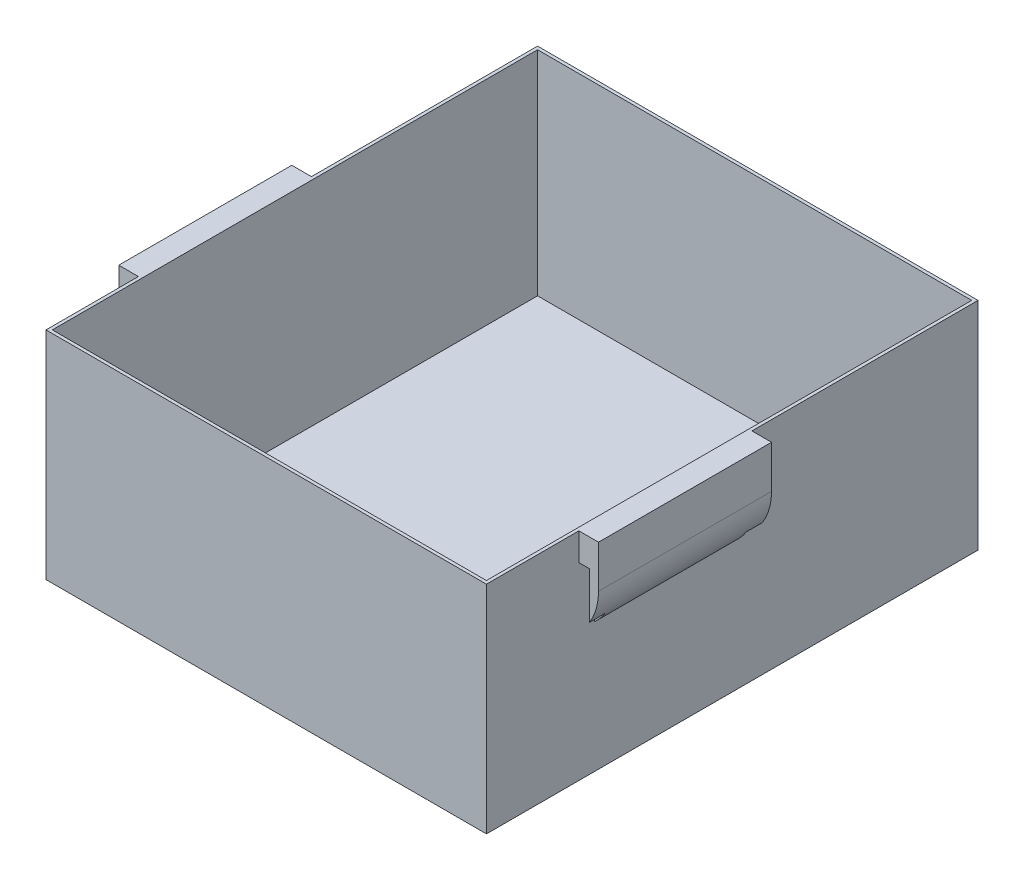
ISO-10303-21;
HEADER;
FILE_DESCRIPTION(('STEP AP214'),'2;1');
FILE_NAME('part.step','',(''),(''),'','','');
FILE_SCHEMA(('AUTOMOTIVE_DESIGN { 1 0 10303 214 1 1 1 1 }'));
ENDSEC;
DATA;
#1=APPLICATION_CONTEXT('core data for automotive mechanical design processes');
#2=APPLICATION_PROTOCOL_DEFINITION('international standard','automotive_design',2000,#1);
#3=PRODUCT_CONTEXT('',#1,'mechanical');
#4=PRODUCT('Part','Part','',(#3));
#5=PRODUCT_RELATED_PRODUCT_CATEGORY('part','',(#4));
#6=PRODUCT_DEFINITION_FORMATION('','',#4);
#7=PRODUCT_DEFINITION_CONTEXT('part definition',#1,'design');
#8=PRODUCT_DEFINITION('design','',#6,#7);
#9=PRODUCT_DEFINITION_SHAPE('','',#8);
#10=(LENGTH_UNIT() NAMED_UNIT(*) SI_UNIT(.MILLI.,.METRE.));
#11=(NAMED_UNIT(*) PLANE_ANGLE_UNIT() SI_UNIT($,.RADIAN.));
#12=(NAMED_UNIT(*) SI_UNIT($,.STERADIAN.) SOLID_ANGLE_UNIT());
#13=UNCERTAINTY_MEASURE_WITH_UNIT(LENGTH_MEASURE(1.E-05),#10,'distance_accuracy_value','');
#14=(GEOMETRIC_REPRESENTATION_CONTEXT(3) GLOBAL_UNCERTAINTY_ASSIGNED_CONTEXT((#13)) GLOBAL_UNIT_ASSIGNED_CONTEXT((#10,
#11,#12)) REPRESENTATION_CONTEXT('',''));
#15=CARTESIAN_POINT('',(0.,0.,0.));
#16=DIRECTION('',(0.,0.,1.));
#17=DIRECTION('',(1.,0.,0.));
#18=AXIS2_PLACEMENT_3D('',#15,#16,#17);
#19=CARTESIAN_POINT('',(-61.,55.,-5.));
#20=DIRECTION('',(0.,0.,-1.));
#21=DIRECTION('',(-1.,0.,0.));
#22=AXIS2_PLACEMENT_3D('',#19,#20,#21);
#23=PLANE('',#22);
#24=DIRECTION('',(0.,-1.,0.));
#25=VECTOR('',#24,1.);
#26=CARTESIAN_POINT('',(-58.65,33.,-5.));
#27=LINE('',#26,#25);
#28=CARTESIAN_POINT('',(-58.65,48.,-5.));
#29=VERTEX_POINT('',#28);
#30=CARTESIAN_POINT('',(-58.65,36.1194776507404,-5.));
#31=VERTEX_POINT('',#30);
#32=EDGE_CURVE('E824',#29,#31,#27,.T.);
#33=ORIENTED_EDGE('',*,*,#32,.T.);
#34=CARTESIAN_POINT('',(-46.,44.1803398874989,-5.));
#35=DIRECTION('',(0.,0.,-1.));
#36=DIRECTION('',(-1.,0.,0.));
#37=AXIS2_PLACEMENT_3D('',#34,#35,#36);
#38=CIRCLE('',#37,15.);
#39=CARTESIAN_POINT('',(-61.,44.1803398874989,-5.));
#40=VERTEX_POINT('',#39);
#41=EDGE_CURVE('E765',#31,#40,#38,.T.);
#42=ORIENTED_EDGE('',*,*,#41,.T.);
#43=DIRECTION('',(0.,1.,0.));
#44=VECTOR('',#43,1.);
#45=CARTESIAN_POINT('',(-61.,55.,-5.));
#46=LINE('',#45,#44);
#47=CARTESIAN_POINT('',(-61.,55.,-5.));
#48=VERTEX_POINT('',#47);
#49=EDGE_CURVE('E773',#40,#48,#46,.T.);
#50=ORIENTED_EDGE('',*,*,#49,.T.);
#51=DIRECTION('',(1.,0.,0.));
#52=VECTOR('',#51,1.);
#53=CARTESIAN_POINT('',(-61.,55.,-5.));
#54=LINE('',#53,#52);
#55=CARTESIAN_POINT('',(-56.,55.,-5.));
#56=VERTEX_POINT('',#55);
#57=EDGE_CURVE('E793',#48,#56,#54,.T.);
#58=ORIENTED_EDGE('',*,*,#57,.T.);
#59=DIRECTION('',(0.,1.,0.));
#60=VECTOR('',#59,1.);
#61=CARTESIAN_POINT('',(-56.,55.,-5.));
#62=LINE('',#61,#60);
#63=CARTESIAN_POINT('',(-56.,48.,-5.));
#64=VERTEX_POINT('',#63);
#65=EDGE_CURVE('E246',#64,#56,#62,.T.);
#66=ORIENTED_EDGE('',*,*,#65,.F.);
#67=DIRECTION('',(-1.,0.,0.));
#68=VECTOR('',#67,1.);
#69=CARTESIAN_POINT('',(-56.,48.,-5.));
#70=LINE('',#69,#68);
#71=EDGE_CURVE('E237',#64,#29,#70,.T.);
#72=ORIENTED_EDGE('',*,*,#71,.T.);
#73=EDGE_LOOP('',(#33,#42,#50,#58,#66,#72));
#74=FACE_BOUND('',#73,.T.);
#75=ADVANCED_FACE('F33',(#74),#23,.T.);
#76=CARTESIAN_POINT('',(-61.,55.,39.));
#77=DIRECTION('',(0.,0.,1.));
#78=DIRECTION('',(1.,0.,0.));
#79=AXIS2_PLACEMENT_3D('',#76,#77,#78);
#80=PLANE('',#79);
#81=DIRECTION('',(0.,-1.,0.));
#82=VECTOR('',#81,1.);
#83=CARTESIAN_POINT('',(-61.,55.,39.));
#84=LINE('',#83,#82);
#85=CARTESIAN_POINT('',(-61.,55.,39.));
#86=VERTEX_POINT('',#85);
#87=CARTESIAN_POINT('',(-61.,44.1803398874989,39.));
#88=VERTEX_POINT('',#87);
#89=EDGE_CURVE('E245',#86,#88,#84,.T.);
#90=ORIENTED_EDGE('',*,*,#89,.T.);
#91=CARTESIAN_POINT('',(-46.,44.1803398874989,39.));
#92=DIRECTION('',(0.,0.,1.));
#93=DIRECTION('',(1.,0.,0.));
#94=AXIS2_PLACEMENT_3D('',#91,#92,#93);
#95=CIRCLE('',#94,15.);
#96=CARTESIAN_POINT('',(-58.65,36.1194776507404,39.));
#97=VERTEX_POINT('',#96);
#98=EDGE_CURVE('E55',#88,#97,#95,.T.);
#99=ORIENTED_EDGE('',*,*,#98,.T.);
#100=DIRECTION('',(0.,1.,0.));
#101=VECTOR('',#100,1.);
#102=CARTESIAN_POINT('',(-58.65,33.,39.));
#103=LINE('',#102,#101);
#104=CARTESIAN_POINT('',(-58.65,48.,39.));
#105=VERTEX_POINT('',#104);
#106=EDGE_CURVE('E789',#97,#105,#103,.T.);
#107=ORIENTED_EDGE('',*,*,#106,.T.);
#108=DIRECTION('',(1.,0.,0.));
#109=VECTOR('',#108,1.);
#110=CARTESIAN_POINT('',(-56.,48.,39.));
#111=LINE('',#110,#109);
#112=CARTESIAN_POINT('',(-56.,48.,39.));
#113=VERTEX_POINT('',#112);
#114=EDGE_CURVE('E786',#105,#113,#111,.T.);
#115=ORIENTED_EDGE('',*,*,#114,.T.);
#116=DIRECTION('',(0.,-1.,0.));
#117=VECTOR('',#116,1.);
#118=CARTESIAN_POINT('',(-56.,55.,39.));
#119=LINE('',#118,#117);
#120=CARTESIAN_POINT('',(-56.,55.,39.));
#121=VERTEX_POINT('',#120);
#122=EDGE_CURVE('E250',#121,#113,#119,.T.);
#123=ORIENTED_EDGE('',*,*,#122,.F.);
#124=DIRECTION('',(1.,0.,0.));
#125=VECTOR('',#124,1.);
#126=CARTESIAN_POINT('',(-61.,55.,39.));
#127=LINE('',#126,#125);
#128=EDGE_CURVE('E270',#86,#121,#127,.T.);
#129=ORIENTED_EDGE('',*,*,#128,.F.);
#130=EDGE_LOOP('',(#90,#99,#107,#115,#123,#129));
#131=FACE_BOUND('',#130,.T.);
#132=ADVANCED_FACE('F464',(#131),#80,.T.);
#133=CARTESIAN_POINT('',(56.,55.,-62.5));
#134=DIRECTION('',(-1.,0.,0.));
#135=DIRECTION('',(0.,0.,1.));
#136=AXIS2_PLACEMENT_3D('',#133,#134,#135);
#137=PLANE('',#136);
#138=DIRECTION('',(0.,-1.,0.));
#139=VECTOR('',#138,1.);
#140=CARTESIAN_POINT('',(56.,55.,39.));
#141=LINE('',#140,#139);
#142=CARTESIAN_POINT('',(56.,55.,39.));
#143=VERTEX_POINT('',#142);
#144=CARTESIAN_POINT('',(56.,48.,39.));
#145=VERTEX_POINT('',#144);
#146=EDGE_CURVE('E291',#143,#145,#141,.T.);
#147=ORIENTED_EDGE('',*,*,#146,.F.);
#148=DIRECTION('',(0.,0.,-1.));
#149=VECTOR('',#148,1.);
#150=CARTESIAN_POINT('',(56.,55.,-62.5));
#151=LINE('',#150,#149);
#152=CARTESIAN_POINT('',(56.,55.,62.5));
#153=VERTEX_POINT('',#152);
#154=EDGE_CURVE('E353',#153,#143,#151,.T.);
#155=ORIENTED_EDGE('',*,*,#154,.F.);
#156=DIRECTION('',(0.,-1.,0.));
#157=VECTOR('',#156,1.);
#158=CARTESIAN_POINT('',(56.,55.,62.5));
#159=LINE('',#158,#157);
#160=CARTESIAN_POINT('',(56.,0.,62.5));
#161=VERTEX_POINT('',#160);
#162=EDGE_CURVE('E329',#153,#161,#159,.T.);
#163=ORIENTED_EDGE('',*,*,#162,.T.);
#164=DIRECTION('',(0.,0.,-1.));
#165=VECTOR('',#164,1.);
#166=CARTESIAN_POINT('',(56.,0.,-62.5));
#167=LINE('',#166,#165);
#168=CARTESIAN_POINT('',(56.,0.,-62.5));
#169=VERTEX_POINT('',#168);
#170=EDGE_CURVE('E330',#161,#169,#167,.T.);
#171=ORIENTED_EDGE('',*,*,#170,.T.);
#172=DIRECTION('',(0.,-1.,0.));
#173=VECTOR('',#172,1.);
#174=CARTESIAN_POINT('',(56.,55.,-62.5));
#175=LINE('',#174,#173);
#176=CARTESIAN_POINT('',(56.,55.,-62.5));
#177=VERTEX_POINT('',#176);
#178=EDGE_CURVE('E349',#177,#169,#175,.T.);
#179=ORIENTED_EDGE('',*,*,#178,.F.);
#180=CARTESIAN_POINT('',(56.,55.,-5.));
#181=VERTEX_POINT('',#180);
#182=EDGE_CURVE('E340',#181,#177,#151,.T.);
#183=ORIENTED_EDGE('',*,*,#182,.F.);
#184=DIRECTION('',(0.,1.,0.));
#185=VECTOR('',#184,1.);
#186=CARTESIAN_POINT('',(56.,55.,-5.));
#187=LINE('',#186,#185);
#188=CARTESIAN_POINT('',(56.,48.,-5.));
#189=VERTEX_POINT('',#188);
#190=EDGE_CURVE('E298',#189,#181,#187,.T.);
#191=ORIENTED_EDGE('',*,*,#190,.F.);
#192=DIRECTION('',(0.,0.,-1.));
#193=VECTOR('',#192,1.);
#194=CARTESIAN_POINT('',(56.,48.,-0.999999999999997));
#195=LINE('',#194,#193);
#196=CARTESIAN_POINT('',(56.,48.,-0.999999999999997));
#197=VERTEX_POINT('',#196);
#198=EDGE_CURVE('E266',#197,#189,#195,.T.);
#199=ORIENTED_EDGE('',*,*,#198,.F.);
#200=DIRECTION('',(0.,1.,0.));
#201=VECTOR('',#200,1.);
#202=CARTESIAN_POINT('',(56.,33.,-0.999999999999997));
#203=LINE('',#202,#201);
#204=CARTESIAN_POINT('',(56.,33.,-0.999999999999997));
#205=VERTEX_POINT('',#204);
#206=EDGE_CURVE('E256',#205,#197,#203,.T.);
#207=ORIENTED_EDGE('',*,*,#206,.F.);
#208=DIRECTION('',(0.,0.,-1.));
#209=VECTOR('',#208,1.);
#210=CARTESIAN_POINT('',(56.,33.,39.));
#211=LINE('',#210,#209);
#212=CARTESIAN_POINT('',(56.,33.,35.));
#213=VERTEX_POINT('',#212);
#214=EDGE_CURVE('E303',#213,#205,#211,.T.);
#215=ORIENTED_EDGE('',*,*,#214,.F.);
#216=DIRECTION('',(0.,-1.,0.));
#217=VECTOR('',#216,1.);
#218=CARTESIAN_POINT('',(56.,33.,35.));
#219=LINE('',#218,#217);
#220=CARTESIAN_POINT('',(56.,48.,35.));
#221=VERTEX_POINT('',#220);
#222=EDGE_CURVE('E277',#221,#213,#219,.T.);
#223=ORIENTED_EDGE('',*,*,#222,.F.);
#224=DIRECTION('',(0.,0.,1.));
#225=VECTOR('',#224,1.);
#226=CARTESIAN_POINT('',(56.,48.,35.));
#227=LINE('',#226,#225);
#228=EDGE_CURVE('E289',#221,#145,#227,.T.);
#229=ORIENTED_EDGE('',*,*,#228,.T.);
#230=EDGE_LOOP('',(#147,#155,#163,#171,#179,#183,#191,#199,#207,#215,#223,#229));
#231=FACE_BOUND('',#230,.T.);
#232=ADVANCED_FACE('F442',(#231),#137,.F.);
#233=CARTESIAN_POINT('',(-56.,55.,-62.5));
#234=DIRECTION('',(0.,0.,1.));
#235=DIRECTION('',(1.,0.,0.));
#236=AXIS2_PLACEMENT_3D('',#233,#234,#235);
#237=PLANE('',#236);
#238=DIRECTION('',(-1.,0.,0.));
#239=VECTOR('',#238,1.);
#240=CARTESIAN_POINT('',(-56.,0.,-62.5));
#241=LINE('',#240,#239);
#242=CARTESIAN_POINT('',(-56.,0.,-62.5));
#243=VERTEX_POINT('',#242);
#244=EDGE_CURVE('E333',#169,#243,#241,.T.);
#245=ORIENTED_EDGE('',*,*,#244,.T.);
#246=DIRECTION('',(0.,-1.,0.));
#247=VECTOR('',#246,1.);
#248=CARTESIAN_POINT('',(-56.,55.,-62.5));
#249=LINE('',#248,#247);
#250=CARTESIAN_POINT('',(-56.,55.,-62.5));
#251=VERTEX_POINT('',#250);
#252=EDGE_CURVE('E346',#251,#243,#249,.T.);
#253=ORIENTED_EDGE('',*,*,#252,.F.);
#254=DIRECTION('',(-1.,0.,0.));
#255=VECTOR('',#254,1.);
#256=CARTESIAN_POINT('',(-56.,55.,-62.5));
#257=LINE('',#256,#255);
#258=EDGE_CURVE('E325',#177,#251,#257,.T.);
#259=ORIENTED_EDGE('',*,*,#258,.F.);
#260=ORIENTED_EDGE('',*,*,#178,.T.);
#261=EDGE_LOOP('',(#245,#253,#259,#260));
#262=FACE_BOUND('',#261,.T.);
#263=ADVANCED_FACE('F445',(#262),#237,.F.);
#264=CARTESIAN_POINT('',(-56.,55.,-62.5));
#265=DIRECTION('',(1.,0.,0.));
#266=DIRECTION('',(0.,0.,-1.));
#267=AXIS2_PLACEMENT_3D('',#264,#265,#266);
#268=PLANE('',#267);
#269=DIRECTION('',(0.,0.,1.));
#270=VECTOR('',#269,1.);
#271=CARTESIAN_POINT('',(-56.,55.,-62.5));
#272=LINE('',#271,#270);
#273=CARTESIAN_POINT('',(-56.,55.,62.5));
#274=VERTEX_POINT('',#273);
#275=EDGE_CURVE('E320',#121,#274,#272,.T.);
#276=ORIENTED_EDGE('',*,*,#275,.F.);
#277=ORIENTED_EDGE('',*,*,#122,.T.);
#278=DIRECTION('',(0.,0.,1.));
#279=VECTOR('',#278,1.);
#280=CARTESIAN_POINT('',(-56.,48.,35.));
#281=LINE('',#280,#279);
#282=CARTESIAN_POINT('',(-56.,48.,35.));
#283=VERTEX_POINT('',#282);
#284=EDGE_CURVE('E779',#283,#113,#281,.T.);
#285=ORIENTED_EDGE('',*,*,#284,.F.);
#286=DIRECTION('',(0.,-1.,0.));
#287=VECTOR('',#286,1.);
#288=CARTESIAN_POINT('',(-56.,33.,35.));
#289=LINE('',#288,#287);
#290=CARTESIAN_POINT('',(-56.,33.,35.));
#291=VERTEX_POINT('',#290);
#292=EDGE_CURVE('E244',#283,#291,#289,.T.);
#293=ORIENTED_EDGE('',*,*,#292,.T.);
#294=DIRECTION('',(0.,0.,-1.));
#295=VECTOR('',#294,1.);
#296=CARTESIAN_POINT('',(-56.,33.,39.));
#297=LINE('',#296,#295);
#298=CARTESIAN_POINT('',(-56.,33.,-0.999999999999997));
#299=VERTEX_POINT('',#298);
#300=EDGE_CURVE('E221',#291,#299,#297,.T.);
#301=ORIENTED_EDGE('',*,*,#300,.T.);
#302=DIRECTION('',(0.,1.,0.));
#303=VECTOR('',#302,1.);
#304=CARTESIAN_POINT('',(-56.,33.,-0.999999999999997));
#305=LINE('',#304,#303);
#306=CARTESIAN_POINT('',(-56.,48.,-0.999999999999997));
#307=VERTEX_POINT('',#306);
#308=EDGE_CURVE('E230',#299,#307,#305,.T.);
#309=ORIENTED_EDGE('',*,*,#308,.T.);
#310=DIRECTION('',(0.,0.,-1.));
#311=VECTOR('',#310,1.);
#312=CARTESIAN_POINT('',(-56.,48.,-0.999999999999997));
#313=LINE('',#312,#311);
#314=EDGE_CURVE('E790',#307,#64,#313,.T.);
#315=ORIENTED_EDGE('',*,*,#314,.T.);
#316=ORIENTED_EDGE('',*,*,#65,.T.);
#317=EDGE_CURVE('E315',#251,#56,#272,.T.);
#318=ORIENTED_EDGE('',*,*,#317,.F.);
#319=ORIENTED_EDGE('',*,*,#252,.T.);
#320=DIRECTION('',(0.,0.,1.));
#321=VECTOR('',#320,1.);
#322=CARTESIAN_POINT('',(-56.,0.,-62.5));
#323=LINE('',#322,#321);
#324=CARTESIAN_POINT('',(-56.,0.,62.5));
#325=VERTEX_POINT('',#324);
#326=EDGE_CURVE('E336',#243,#325,#323,.T.);
#327=ORIENTED_EDGE('',*,*,#326,.T.);
#328=DIRECTION('',(0.,-1.,0.));
#329=VECTOR('',#328,1.);
#330=CARTESIAN_POINT('',(-56.,55.,62.5));
#331=LINE('',#330,#329);
#332=EDGE_CURVE('E343',#274,#325,#331,.T.);
#333=ORIENTED_EDGE('',*,*,#332,.F.);
#334=EDGE_LOOP('',(#276,#277,#285,#293,#301,#309,#315,#316,#318,#319,#327,#333));
#335=FACE_BOUND('',#334,.T.);
#336=ADVANCED_FACE('F241',(#335),#268,.F.);
#337=CARTESIAN_POINT('',(-56.,55.,62.5));
#338=DIRECTION('',(0.,0.,-1.));
#339=DIRECTION('',(-1.,0.,0.));
#340=AXIS2_PLACEMENT_3D('',#337,#338,#339);
#341=PLANE('',#340);
#342=DIRECTION('',(1.,0.,0.));
#343=VECTOR('',#342,1.);
#344=CARTESIAN_POINT('',(-56.,0.,62.5));
#345=LINE('',#344,#343);
#346=EDGE_CURVE('E338',#325,#161,#345,.T.);
#347=ORIENTED_EDGE('',*,*,#346,.T.);
#348=ORIENTED_EDGE('',*,*,#162,.F.);
#349=DIRECTION('',(1.,0.,0.));
#350=VECTOR('',#349,1.);
#351=CARTESIAN_POINT('',(-56.,55.,62.5));
#352=LINE('',#351,#350);
#353=EDGE_CURVE('E319',#274,#153,#352,.T.);
#354=ORIENTED_EDGE('',*,*,#353,.F.);
#355=ORIENTED_EDGE('',*,*,#332,.T.);
#356=EDGE_LOOP('',(#347,#348,#354,#355));
#357=FACE_BOUND('',#356,.T.);
#358=ADVANCED_FACE('F411',(#357),#341,.F.);
#359=CARTESIAN_POINT('',(0.,55.,0.));
#360=DIRECTION('',(0.,1.,0.));
#361=DIRECTION('',(0.,0.,1.));
#362=AXIS2_PLACEMENT_3D('',#359,#360,#361);
#363=PLANE('',#362);
#364=DIRECTION('',(0.,0.,-1.));
#365=VECTOR('',#364,1.);
#366=CARTESIAN_POINT('',(55.2,55.,-61.7));
#367=LINE('',#366,#365);
#368=CARTESIAN_POINT('',(55.2,55.,61.7));
#369=VERTEX_POINT('',#368);
#370=CARTESIAN_POINT('',(55.2,55.,-61.7));
#371=VERTEX_POINT('',#370);
#372=EDGE_CURVE('E378',#369,#371,#367,.T.);
#373=ORIENTED_EDGE('',*,*,#372,.F.);
#374=DIRECTION('',(1.,0.,0.));
#375=VECTOR('',#374,1.);
#376=CARTESIAN_POINT('',(-55.2,55.,61.7));
#377=LINE('',#376,#375);
#378=CARTESIAN_POINT('',(-55.2,55.,61.7));
#379=VERTEX_POINT('',#378);
#380=EDGE_CURVE('E369',#379,#369,#377,.T.);
#381=ORIENTED_EDGE('',*,*,#380,.F.);
#382=DIRECTION('',(0.,0.,1.));
#383=VECTOR('',#382,1.);
#384=CARTESIAN_POINT('',(-55.2,55.,-61.7));
#385=LINE('',#384,#383);
#386=CARTESIAN_POINT('',(-55.2,55.,-61.7));
#387=VERTEX_POINT('',#386);
#388=EDGE_CURVE('E372',#387,#379,#385,.T.);
#389=ORIENTED_EDGE('',*,*,#388,.F.);
#390=DIRECTION('',(-1.,0.,0.));
#391=VECTOR('',#390,1.);
#392=CARTESIAN_POINT('',(-55.2,55.,-61.7));
#393=LINE('',#392,#391);
#394=EDGE_CURVE('E375',#371,#387,#393,.T.);
#395=ORIENTED_EDGE('',*,*,#394,.F.);
#396=EDGE_LOOP('',(#373,#381,#389,#395));
#397=FACE_BOUND('',#396,.T.);
#398=ORIENTED_EDGE('',*,*,#154,.T.);
#399=DIRECTION('',(-1.,0.,0.));
#400=VECTOR('',#399,1.);
#401=CARTESIAN_POINT('',(61.,55.,39.));
#402=LINE('',#401,#400);
#403=CARTESIAN_POINT('',(61.,55.,39.));
#404=VERTEX_POINT('',#403);
#405=EDGE_CURVE('E302',#404,#143,#402,.T.);
#406=ORIENTED_EDGE('',*,*,#405,.F.);
#407=DIRECTION('',(0.,0.,1.));
#408=VECTOR('',#407,1.);
#409=CARTESIAN_POINT('',(61.,55.,39.));
#410=LINE('',#409,#408);
#411=CARTESIAN_POINT('',(61.,55.,-5.));
#412=VERTEX_POINT('',#411);
#413=EDGE_CURVE('E300',#412,#404,#410,.T.);
#414=ORIENTED_EDGE('',*,*,#413,.F.);
#415=DIRECTION('',(-1.,0.,0.));
#416=VECTOR('',#415,1.);
#417=CARTESIAN_POINT('',(61.,55.,-5.));
#418=LINE('',#417,#416);
#419=EDGE_CURVE('E380',#412,#181,#418,.T.);
#420=ORIENTED_EDGE('',*,*,#419,.T.);
#421=ORIENTED_EDGE('',*,*,#182,.T.);
#422=ORIENTED_EDGE('',*,*,#258,.T.);
#423=ORIENTED_EDGE('',*,*,#317,.T.);
#424=ORIENTED_EDGE('',*,*,#57,.F.);
#425=DIRECTION('',(0.,0.,1.));
#426=VECTOR('',#425,1.);
#427=CARTESIAN_POINT('',(-61.,55.,39.));
#428=LINE('',#427,#426);
#429=EDGE_CURVE('E248',#48,#86,#428,.T.);
#430=ORIENTED_EDGE('',*,*,#429,.T.);
#431=ORIENTED_EDGE('',*,*,#128,.T.);
#432=ORIENTED_EDGE('',*,*,#275,.T.);
#433=ORIENTED_EDGE('',*,*,#353,.T.);
#434=EDGE_LOOP('',(#398,#406,#414,#420,#421,#422,#423,#424,#430,#431,#432,#433));
#435=FACE_BOUND('',#434,.T.);
#436=ADVANCED_FACE('F407',(#397,#435),#363,.T.);
#437=CARTESIAN_POINT('',(0.,0.,0.));
#438=DIRECTION('',(0.,1.,0.));
#439=DIRECTION('',(0.,0.,1.));
#440=AXIS2_PLACEMENT_3D('',#437,#438,#439);
#441=PLANE('',#440);
#442=ORIENTED_EDGE('',*,*,#170,.F.);
#443=ORIENTED_EDGE('',*,*,#346,.F.);
#444=ORIENTED_EDGE('',*,*,#326,.F.);
#445=ORIENTED_EDGE('',*,*,#244,.F.);
#446=EDGE_LOOP('',(#442,#443,#444,#445));
#447=FACE_BOUND('',#446,.T.);
#448=ADVANCED_FACE('F410',(#447),#441,.F.);
#449=CARTESIAN_POINT('',(55.2,0.799999999999995,-61.7));
#450=DIRECTION('',(1.,0.,0.));
#451=DIRECTION('',(0.,0.,-1.));
#452=AXIS2_PLACEMENT_3D('',#449,#450,#451);
#453=PLANE('',#452);
#454=ORIENTED_EDGE('',*,*,#372,.T.);
#455=DIRECTION('',(0.,1.,0.));
#456=VECTOR('',#455,1.);
#457=CARTESIAN_POINT('',(55.2,0.799999999999995,-61.7));
#458=LINE('',#457,#456);
#459=CARTESIAN_POINT('',(55.2,0.799999999999995,-61.7));
#460=VERTEX_POINT('',#459);
#461=EDGE_CURVE('E359',#460,#371,#458,.T.);
#462=ORIENTED_EDGE('',*,*,#461,.F.);
#463=DIRECTION('',(0.,0.,-1.));
#464=VECTOR('',#463,1.);
#465=CARTESIAN_POINT('',(55.2,0.799999999999995,-61.7));
#466=LINE('',#465,#464);
#467=CARTESIAN_POINT('',(55.2,0.799999999999995,61.7));
#468=VERTEX_POINT('',#467);
#469=EDGE_CURVE('E308',#468,#460,#466,.T.);
#470=ORIENTED_EDGE('',*,*,#469,.F.);
#471=DIRECTION('',(0.,1.,0.));
#472=VECTOR('',#471,1.);
#473=CARTESIAN_POINT('',(55.2,0.799999999999995,61.7));
#474=LINE('',#473,#472);
#475=EDGE_CURVE('E334',#468,#369,#474,.T.);
#476=ORIENTED_EDGE('',*,*,#475,.T.);
#477=EDGE_LOOP('',(#454,#462,#470,#476));
#478=FACE_BOUND('',#477,.T.);
#479=ADVANCED_FACE('F394',(#478),#453,.F.);
#480=CARTESIAN_POINT('',(-55.2,0.799999999999995,61.7));
#481=DIRECTION('',(0.,0.,1.));
#482=DIRECTION('',(1.,0.,0.));
#483=AXIS2_PLACEMENT_3D('',#480,#481,#482);
#484=PLANE('',#483);
#485=ORIENTED_EDGE('',*,*,#380,.T.);
#486=ORIENTED_EDGE('',*,*,#475,.F.);
#487=DIRECTION('',(1.,0.,0.));
#488=VECTOR('',#487,1.);
#489=CARTESIAN_POINT('',(-55.2,0.799999999999995,61.7));
#490=LINE('',#489,#488);
#491=CARTESIAN_POINT('',(-55.2,0.799999999999995,61.7));
#492=VERTEX_POINT('',#491);
#493=EDGE_CURVE('E364',#492,#468,#490,.T.);
#494=ORIENTED_EDGE('',*,*,#493,.F.);
#495=DIRECTION('',(0.,1.,0.));
#496=VECTOR('',#495,1.);
#497=CARTESIAN_POINT('',(-55.2,0.799999999999995,61.7));
#498=LINE('',#497,#496);
#499=EDGE_CURVE('E366',#492,#379,#498,.T.);
#500=ORIENTED_EDGE('',*,*,#499,.T.);
#501=EDGE_LOOP('',(#485,#486,#494,#500));
#502=FACE_BOUND('',#501,.T.);
#503=ADVANCED_FACE('F404',(#502),#484,.F.);
#504=CARTESIAN_POINT('',(-55.2,0.799999999999995,-61.7));
#505=DIRECTION('',(-1.,0.,0.));
#506=DIRECTION('',(0.,0.,1.));
#507=AXIS2_PLACEMENT_3D('',#504,#505,#506);
#508=PLANE('',#507);
#509=ORIENTED_EDGE('',*,*,#388,.T.);
#510=ORIENTED_EDGE('',*,*,#499,.F.);
#511=DIRECTION('',(0.,0.,1.));
#512=VECTOR('',#511,1.);
#513=CARTESIAN_POINT('',(-55.2,0.799999999999995,-61.7));
#514=LINE('',#513,#512);
#515=CARTESIAN_POINT('',(-55.2,0.799999999999995,-61.7));
#516=VERTEX_POINT('',#515);
#517=EDGE_CURVE('E383',#516,#492,#514,.T.);
#518=ORIENTED_EDGE('',*,*,#517,.F.);
#519=DIRECTION('',(0.,1.,0.));
#520=VECTOR('',#519,1.);
#521=CARTESIAN_POINT('',(-55.2,0.799999999999995,-61.7));
#522=LINE('',#521,#520);
#523=EDGE_CURVE('E363',#516,#387,#522,.T.);
#524=ORIENTED_EDGE('',*,*,#523,.T.);
#525=EDGE_LOOP('',(#509,#510,#518,#524));
#526=FACE_BOUND('',#525,.T.);
#527=ADVANCED_FACE('F402',(#526),#508,.F.);
#528=CARTESIAN_POINT('',(-55.2,0.799999999999995,-61.7));
#529=DIRECTION('',(0.,0.,-1.));
#530=DIRECTION('',(-1.,0.,0.));
#531=AXIS2_PLACEMENT_3D('',#528,#529,#530);
#532=PLANE('',#531);
#533=ORIENTED_EDGE('',*,*,#394,.T.);
#534=ORIENTED_EDGE('',*,*,#523,.F.);
#535=DIRECTION('',(-1.,0.,0.));
#536=VECTOR('',#535,1.);
#537=CARTESIAN_POINT('',(-55.2,0.799999999999995,-61.7));
#538=LINE('',#537,#536);
#539=EDGE_CURVE('E385',#460,#516,#538,.T.);
#540=ORIENTED_EDGE('',*,*,#539,.F.);
#541=ORIENTED_EDGE('',*,*,#461,.T.);
#542=EDGE_LOOP('',(#533,#534,#540,#541));
#543=FACE_BOUND('',#542,.T.);
#544=ADVANCED_FACE('F398',(#543),#532,.F.);
#545=CARTESIAN_POINT('',(0.,0.799999999999995,0.));
#546=DIRECTION('',(0.,1.,0.));
#547=DIRECTION('',(0.,0.,1.));
#548=AXIS2_PLACEMENT_3D('',#545,#546,#547);
#549=PLANE('',#548);
#550=ORIENTED_EDGE('',*,*,#469,.T.);
#551=ORIENTED_EDGE('',*,*,#539,.T.);
#552=ORIENTED_EDGE('',*,*,#517,.T.);
#553=ORIENTED_EDGE('',*,*,#493,.T.);
#554=EDGE_LOOP('',(#550,#551,#552,#553));
#555=FACE_BOUND('',#554,.T.);
#556=ADVANCED_FACE('F391',(#555),#549,.T.);
#557=CARTESIAN_POINT('',(61.,55.,39.));
#558=DIRECTION('',(0.,0.,-1.));
#559=DIRECTION('',(-1.,0.,0.));
#560=AXIS2_PLACEMENT_3D('',#557,#558,#559);
#561=PLANE('',#560);
#562=DIRECTION('',(0.,1.,0.));
#563=VECTOR('',#562,1.);
#564=CARTESIAN_POINT('',(58.65,33.,39.));
#565=LINE('',#564,#563);
#566=CARTESIAN_POINT('',(58.65,36.1194776507404,39.));
#567=VERTEX_POINT('',#566);
#568=CARTESIAN_POINT('',(58.65,48.,39.));
#569=VERTEX_POINT('',#568);
#570=EDGE_CURVE('E275',#567,#569,#565,.T.);
#571=ORIENTED_EDGE('',*,*,#570,.F.);
#572=CARTESIAN_POINT('',(46.,44.1803398874989,39.));
#573=DIRECTION('',(0.,0.,-1.));
#574=DIRECTION('',(-1.,0.,0.));
#575=AXIS2_PLACEMENT_3D('',#572,#573,#574);
#576=CIRCLE('',#575,15.);
#577=CARTESIAN_POINT('',(61.,44.1803398874989,39.));
#578=VERTEX_POINT('',#577);
#579=EDGE_CURVE('E227',#567,#578,#576,.F.);
#580=ORIENTED_EDGE('',*,*,#579,.T.);
#581=DIRECTION('',(0.,-1.,0.));
#582=VECTOR('',#581,1.);
#583=CARTESIAN_POINT('',(61.,55.,39.));
#584=LINE('',#583,#582);
#585=EDGE_CURVE('E294',#404,#578,#584,.T.);
#586=ORIENTED_EDGE('',*,*,#585,.F.);
#587=ORIENTED_EDGE('',*,*,#405,.T.);
#588=ORIENTED_EDGE('',*,*,#146,.T.);
#589=DIRECTION('',(-1.,0.,0.));
#590=VECTOR('',#589,1.);
#591=CARTESIAN_POINT('',(56.,48.,39.));
#592=LINE('',#591,#590);
#593=EDGE_CURVE('E280',#569,#145,#592,.T.);
#594=ORIENTED_EDGE('',*,*,#593,.F.);
#595=EDGE_LOOP('',(#571,#580,#586,#587,#588,#594));
#596=FACE_BOUND('',#595,.T.);
#597=ADVANCED_FACE('F424',(#596),#561,.F.);
#598=CARTESIAN_POINT('',(61.,55.,-5.));
#599=DIRECTION('',(0.,0.,1.));
#600=DIRECTION('',(1.,0.,0.));
#601=AXIS2_PLACEMENT_3D('',#598,#599,#600);
#602=PLANE('',#601);
#603=DIRECTION('',(0.,1.,0.));
#604=VECTOR('',#603,1.);
#605=CARTESIAN_POINT('',(61.,55.,-5.));
#606=LINE('',#605,#604);
#607=CARTESIAN_POINT('',(61.,44.1803398874989,-5.));
#608=VERTEX_POINT('',#607);
#609=EDGE_CURVE('E297',#608,#412,#606,.T.);
#610=ORIENTED_EDGE('',*,*,#609,.F.);
#611=CARTESIAN_POINT('',(46.,44.1803398874989,-5.));
#612=DIRECTION('',(0.,0.,1.));
#613=DIRECTION('',(1.,0.,0.));
#614=AXIS2_PLACEMENT_3D('',#611,#612,#613);
#615=CIRCLE('',#614,15.);
#616=CARTESIAN_POINT('',(58.65,36.1194776507404,-5.));
#617=VERTEX_POINT('',#616);
#618=EDGE_CURVE('E808',#608,#617,#615,.F.);
#619=ORIENTED_EDGE('',*,*,#618,.T.);
#620=DIRECTION('',(0.,-1.,0.));
#621=VECTOR('',#620,1.);
#622=CARTESIAN_POINT('',(58.65,33.,-5.));
#623=LINE('',#622,#621);
#624=CARTESIAN_POINT('',(58.65,48.,-5.));
#625=VERTEX_POINT('',#624);
#626=EDGE_CURVE('E260',#625,#617,#623,.T.);
#627=ORIENTED_EDGE('',*,*,#626,.F.);
#628=DIRECTION('',(1.,0.,0.));
#629=VECTOR('',#628,1.);
#630=CARTESIAN_POINT('',(56.,48.,-5.));
#631=LINE('',#630,#629);
#632=EDGE_CURVE('E267',#189,#625,#631,.T.);
#633=ORIENTED_EDGE('',*,*,#632,.F.);
#634=ORIENTED_EDGE('',*,*,#190,.T.);
#635=ORIENTED_EDGE('',*,*,#419,.F.);
#636=EDGE_LOOP('',(#610,#619,#627,#633,#634,#635));
#637=FACE_BOUND('',#636,.T.);
#638=ADVANCED_FACE('F437',(#637),#602,.F.);
#639=CARTESIAN_POINT('',(61.,0.,0.));
#640=DIRECTION('',(1.,0.,0.));
#641=DIRECTION('',(0.,0.,-1.));
#642=AXIS2_PLACEMENT_3D('',#639,#640,#641);
#643=PLANE('',#642);
#644=ORIENTED_EDGE('',*,*,#585,.T.);
#645=DIRECTION('',(0.,0.,-1.));
#646=VECTOR('',#645,1.);
#647=CARTESIAN_POINT('',(61.,44.1803398874989,-5.));
#648=LINE('',#647,#646);
#649=EDGE_CURVE('E352',#578,#608,#648,.T.);
#650=ORIENTED_EDGE('',*,*,#649,.T.);
#651=ORIENTED_EDGE('',*,*,#609,.T.);
#652=ORIENTED_EDGE('',*,*,#413,.T.);
#653=EDGE_LOOP('',(#644,#650,#651,#652));
#654=FACE_BOUND('',#653,.T.);
#655=ADVANCED_FACE('F496',(#654),#643,.T.);
#656=CARTESIAN_POINT('',(56.,48.,35.));
#657=DIRECTION('',(0.,1.,0.));
#658=DIRECTION('',(0.,0.,1.));
#659=AXIS2_PLACEMENT_3D('',#656,#657,#658);
#660=PLANE('',#659);
#661=ORIENTED_EDGE('',*,*,#593,.T.);
#662=ORIENTED_EDGE('',*,*,#228,.F.);
#663=DIRECTION('',(-1.,0.,0.));
#664=VECTOR('',#663,1.);
#665=CARTESIAN_POINT('',(56.,48.,35.));
#666=LINE('',#665,#664);
#667=CARTESIAN_POINT('',(58.65,48.,35.));
#668=VERTEX_POINT('',#667);
#669=EDGE_CURVE('E282',#668,#221,#666,.T.);
#670=ORIENTED_EDGE('',*,*,#669,.F.);
#671=DIRECTION('',(0.,0.,1.));
#672=VECTOR('',#671,1.);
#673=CARTESIAN_POINT('',(58.65,48.,35.));
#674=LINE('',#673,#672);
#675=EDGE_CURVE('E285',#668,#569,#674,.T.);
#676=ORIENTED_EDGE('',*,*,#675,.T.);
#677=EDGE_LOOP('',(#661,#662,#670,#676));
#678=FACE_BOUND('',#677,.T.);
#679=ADVANCED_FACE('F493',(#678),#660,.F.);
#680=CARTESIAN_POINT('',(58.65,33.,35.));
#681=DIRECTION('',(1.,0.,0.));
#682=DIRECTION('',(0.,0.,-1.));
#683=AXIS2_PLACEMENT_3D('',#680,#681,#682);
#684=PLANE('',#683);
#685=DIRECTION('',(0.,1.,0.));
#686=VECTOR('',#685,1.);
#687=CARTESIAN_POINT('',(58.65,33.,35.));
#688=LINE('',#687,#686);
#689=CARTESIAN_POINT('',(58.65,36.1194776507404,35.));
#690=VERTEX_POINT('',#689);
#691=EDGE_CURVE('E279',#690,#668,#688,.T.);
#692=ORIENTED_EDGE('',*,*,#691,.F.);
#693=DIRECTION('',(0.,0.,1.));
#694=VECTOR('',#693,1.);
#695=CARTESIAN_POINT('',(58.65,36.1194776507404,35.));
#696=LINE('',#695,#694);
#697=EDGE_CURVE('E754',#690,#567,#696,.T.);
#698=ORIENTED_EDGE('',*,*,#697,.T.);
#699=ORIENTED_EDGE('',*,*,#570,.T.);
#700=ORIENTED_EDGE('',*,*,#675,.F.);
#701=EDGE_LOOP('',(#692,#698,#699,#700));
#702=FACE_BOUND('',#701,.T.);
#703=ADVANCED_FACE('F491',(#702),#684,.F.);
#704=CARTESIAN_POINT('',(0.,0.,35.));
#705=DIRECTION('',(0.,0.,-1.));
#706=DIRECTION('',(-1.,0.,0.));
#707=AXIS2_PLACEMENT_3D('',#704,#705,#706);
#708=PLANE('',#707);
#709=ORIENTED_EDGE('',*,*,#222,.T.);
#710=CARTESIAN_POINT('',(46.,44.1803398874989,35.));
#711=DIRECTION('',(0.,0.,-1.));
#712=DIRECTION('',(-1.,0.,0.));
#713=AXIS2_PLACEMENT_3D('',#710,#711,#712);
#714=CIRCLE('',#713,15.);
#715=EDGE_CURVE('E750',#213,#690,#714,.F.);
#716=ORIENTED_EDGE('',*,*,#715,.T.);
#717=ORIENTED_EDGE('',*,*,#691,.T.);
#718=ORIENTED_EDGE('',*,*,#669,.T.);
#719=EDGE_LOOP('',(#709,#716,#717,#718));
#720=FACE_BOUND('',#719,.T.);
#721=ADVANCED_FACE('F484',(#720),#708,.F.);
#722=CARTESIAN_POINT('',(58.65,33.,-0.999999999999997));
#723=DIRECTION('',(1.,0.,0.));
#724=DIRECTION('',(0.,0.,-1.));
#725=AXIS2_PLACEMENT_3D('',#722,#723,#724);
#726=PLANE('',#725);
#727=ORIENTED_EDGE('',*,*,#626,.T.);
#728=DIRECTION('',(0.,0.,1.));
#729=VECTOR('',#728,1.);
#730=CARTESIAN_POINT('',(58.65,36.1194776507404,-5.));
#731=LINE('',#730,#729);
#732=CARTESIAN_POINT('',(58.65,36.1194776507404,-0.999999999999994));
#733=VERTEX_POINT('',#732);
#734=EDGE_CURVE('E759',#617,#733,#731,.T.);
#735=ORIENTED_EDGE('',*,*,#734,.T.);
#736=DIRECTION('',(0.,-1.,0.));
#737=VECTOR('',#736,1.);
#738=CARTESIAN_POINT('',(58.65,33.,-0.999999999999997));
#739=LINE('',#738,#737);
#740=CARTESIAN_POINT('',(58.65,48.,-0.999999999999997));
#741=VERTEX_POINT('',#740);
#742=EDGE_CURVE('E263',#741,#733,#739,.T.);
#743=ORIENTED_EDGE('',*,*,#742,.F.);
#744=DIRECTION('',(0.,0.,-1.));
#745=VECTOR('',#744,1.);
#746=CARTESIAN_POINT('',(58.65,48.,-0.999999999999997));
#747=LINE('',#746,#745);
#748=EDGE_CURVE('E273',#741,#625,#747,.T.);
#749=ORIENTED_EDGE('',*,*,#748,.T.);
#750=EDGE_LOOP('',(#727,#735,#743,#749));
#751=FACE_BOUND('',#750,.T.);
#752=ADVANCED_FACE('F481',(#751),#726,.F.);
#753=CARTESIAN_POINT('',(56.,48.,-0.999999999999997));
#754=DIRECTION('',(0.,1.,0.));
#755=DIRECTION('',(0.,0.,1.));
#756=AXIS2_PLACEMENT_3D('',#753,#754,#755);
#757=PLANE('',#756);
#758=ORIENTED_EDGE('',*,*,#632,.T.);
#759=ORIENTED_EDGE('',*,*,#748,.F.);
#760=DIRECTION('',(1.,0.,0.));
#761=VECTOR('',#760,1.);
#762=CARTESIAN_POINT('',(56.,48.,-0.999999999999997));
#763=LINE('',#762,#761);
#764=EDGE_CURVE('E259',#197,#741,#763,.T.);
#765=ORIENTED_EDGE('',*,*,#764,.F.);
#766=ORIENTED_EDGE('',*,*,#198,.T.);
#767=EDGE_LOOP('',(#758,#759,#765,#766));
#768=FACE_BOUND('',#767,.T.);
#769=ADVANCED_FACE('F479',(#768),#757,.F.);
#770=CARTESIAN_POINT('',(0.,0.,-0.999999999999997));
#771=DIRECTION('',(0.,0.,-1.));
#772=DIRECTION('',(-1.,0.,0.));
#773=AXIS2_PLACEMENT_3D('',#770,#771,#772);
#774=PLANE('',#773);
#775=ORIENTED_EDGE('',*,*,#742,.T.);
#776=CARTESIAN_POINT('',(46.,44.1803398874989,-0.999999999999994));
#777=DIRECTION('',(0.,0.,-1.));
#778=DIRECTION('',(-1.,0.,0.));
#779=AXIS2_PLACEMENT_3D('',#776,#777,#778);
#780=CIRCLE('',#779,15.);
#781=EDGE_CURVE('E756',#733,#205,#780,.T.);
#782=ORIENTED_EDGE('',*,*,#781,.T.);
#783=ORIENTED_EDGE('',*,*,#206,.T.);
#784=ORIENTED_EDGE('',*,*,#764,.T.);
#785=EDGE_LOOP('',(#775,#782,#783,#784));
#786=FACE_BOUND('',#785,.T.);
#787=ADVANCED_FACE('F476',(#786),#774,.T.);
#788=CARTESIAN_POINT('',(-61.,0.,0.));
#789=DIRECTION('',(-1.,0.,0.));
#790=DIRECTION('',(0.,0.,-1.));
#791=AXIS2_PLACEMENT_3D('',#788,#789,#790);
#792=PLANE('',#791);
#793=ORIENTED_EDGE('',*,*,#49,.F.);
#794=DIRECTION('',(0.,0.,-1.));
#795=VECTOR('',#794,1.);
#796=CARTESIAN_POINT('',(-61.,44.1803398874989,39.));
#797=LINE('',#796,#795);
#798=EDGE_CURVE('E767',#40,#88,#797,.F.);
#799=ORIENTED_EDGE('',*,*,#798,.T.);
#800=ORIENTED_EDGE('',*,*,#89,.F.);
#801=ORIENTED_EDGE('',*,*,#429,.F.);
#802=EDGE_LOOP('',(#793,#799,#800,#801));
#803=FACE_BOUND('',#802,.T.);
#804=ADVANCED_FACE('F473',(#803),#792,.T.);
#805=CARTESIAN_POINT('',(-58.65,33.,35.));
#806=DIRECTION('',(1.,0.,0.));
#807=DIRECTION('',(0.,0.,-1.));
#808=AXIS2_PLACEMENT_3D('',#805,#806,#807);
#809=PLANE('',#808);
#810=ORIENTED_EDGE('',*,*,#106,.F.);
#811=DIRECTION('',(0.,0.,1.));
#812=VECTOR('',#811,1.);
#813=CARTESIAN_POINT('',(-58.65,36.1194776507404,39.));
#814=LINE('',#813,#812);
#815=CARTESIAN_POINT('',(-58.65,36.1194776507404,35.));
#816=VERTEX_POINT('',#815);
#817=EDGE_CURVE('E41',#97,#816,#814,.F.);
#818=ORIENTED_EDGE('',*,*,#817,.T.);
#819=DIRECTION('',(0.,1.,0.));
#820=VECTOR('',#819,1.);
#821=CARTESIAN_POINT('',(-58.65,33.,35.));
#822=LINE('',#821,#820);
#823=CARTESIAN_POINT('',(-58.65,48.,35.));
#824=VERTEX_POINT('',#823);
#825=EDGE_CURVE('E775',#816,#824,#822,.T.);
#826=ORIENTED_EDGE('',*,*,#825,.T.);
#827=DIRECTION('',(0.,0.,1.));
#828=VECTOR('',#827,1.);
#829=CARTESIAN_POINT('',(-58.65,48.,35.));
#830=LINE('',#829,#828);
#831=EDGE_CURVE('E781',#824,#105,#830,.T.);
#832=ORIENTED_EDGE('',*,*,#831,.T.);
#833=EDGE_LOOP('',(#810,#818,#826,#832));
#834=FACE_BOUND('',#833,.T.);
#835=ADVANCED_FACE('F568',(#834),#809,.T.);
#836=CARTESIAN_POINT('',(-56.,48.,35.));
#837=DIRECTION('',(0.,-1.,0.));
#838=DIRECTION('',(0.,0.,-1.));
#839=AXIS2_PLACEMENT_3D('',#836,#837,#838);
#840=PLANE('',#839);
#841=ORIENTED_EDGE('',*,*,#114,.F.);
#842=ORIENTED_EDGE('',*,*,#831,.F.);
#843=DIRECTION('',(1.,0.,0.));
#844=VECTOR('',#843,1.);
#845=CARTESIAN_POINT('',(-56.,48.,35.));
#846=LINE('',#845,#844);
#847=EDGE_CURVE('E776',#824,#283,#846,.T.);
#848=ORIENTED_EDGE('',*,*,#847,.T.);
#849=ORIENTED_EDGE('',*,*,#284,.T.);
#850=EDGE_LOOP('',(#841,#842,#848,#849));
#851=FACE_BOUND('',#850,.T.);
#852=ADVANCED_FACE('F576',(#851),#840,.T.);
#853=CARTESIAN_POINT('',(0.,0.,35.));
#854=DIRECTION('',(0.,0.,-1.));
#855=DIRECTION('',(1.,0.,0.));
#856=AXIS2_PLACEMENT_3D('',#853,#854,#855);
#857=PLANE('',#856);
#858=ORIENTED_EDGE('',*,*,#825,.F.);
#859=CARTESIAN_POINT('',(-46.,44.1803398874989,35.));
#860=DIRECTION('',(0.,0.,-1.));
#861=DIRECTION('',(-1.,0.,0.));
#862=AXIS2_PLACEMENT_3D('',#859,#860,#861);
#863=CIRCLE('',#862,15.);
#864=EDGE_CURVE('E11',#816,#291,#863,.F.);
#865=ORIENTED_EDGE('',*,*,#864,.T.);
#866=ORIENTED_EDGE('',*,*,#292,.F.);
#867=ORIENTED_EDGE('',*,*,#847,.F.);
#868=EDGE_LOOP('',(#858,#865,#866,#867));
#869=FACE_BOUND('',#868,.T.);
#870=ADVANCED_FACE('F584',(#869),#857,.F.);
#871=CARTESIAN_POINT('',(-56.,48.,-0.999999999999997));
#872=DIRECTION('',(0.,-1.,0.));
#873=DIRECTION('',(0.,0.,-1.));
#874=AXIS2_PLACEMENT_3D('',#871,#872,#873);
#875=PLANE('',#874);
#876=ORIENTED_EDGE('',*,*,#71,.F.);
#877=ORIENTED_EDGE('',*,*,#314,.F.);
#878=DIRECTION('',(-1.,0.,0.));
#879=VECTOR('',#878,1.);
#880=CARTESIAN_POINT('',(-56.,48.,-0.999999999999997));
#881=LINE('',#880,#879);
#882=CARTESIAN_POINT('',(-58.65,48.,-0.999999999999997));
#883=VERTEX_POINT('',#882);
#884=EDGE_CURVE('E232',#307,#883,#881,.T.);
#885=ORIENTED_EDGE('',*,*,#884,.T.);
#886=DIRECTION('',(0.,0.,-1.));
#887=VECTOR('',#886,1.);
#888=CARTESIAN_POINT('',(-58.65,48.,-0.999999999999997));
#889=LINE('',#888,#887);
#890=EDGE_CURVE('E819',#883,#29,#889,.T.);
#891=ORIENTED_EDGE('',*,*,#890,.T.);
#892=EDGE_LOOP('',(#876,#877,#885,#891));
#893=FACE_BOUND('',#892,.T.);
#894=ADVANCED_FACE('F591',(#893),#875,.T.);
#895=CARTESIAN_POINT('',(-58.65,33.,-0.999999999999997));
#896=DIRECTION('',(1.,0.,0.));
#897=DIRECTION('',(0.,0.,-1.));
#898=AXIS2_PLACEMENT_3D('',#895,#896,#897);
#899=PLANE('',#898);
#900=DIRECTION('',(0.,-1.,0.));
#901=VECTOR('',#900,1.);
#902=CARTESIAN_POINT('',(-58.65,33.,-0.999999999999997));
#903=LINE('',#902,#901);
#904=CARTESIAN_POINT('',(-58.65,36.1194776507404,-0.999999999999997));
#905=VERTEX_POINT('',#904);
#906=EDGE_CURVE('E236',#883,#905,#903,.T.);
#907=ORIENTED_EDGE('',*,*,#906,.T.);
#908=DIRECTION('',(0.,0.,1.));
#909=VECTOR('',#908,1.);
#910=CARTESIAN_POINT('',(-58.65,36.1194776507404,-0.999999999999997));
#911=LINE('',#910,#909);
#912=EDGE_CURVE('E223',#905,#31,#911,.F.);
#913=ORIENTED_EDGE('',*,*,#912,.T.);
#914=ORIENTED_EDGE('',*,*,#32,.F.);
#915=ORIENTED_EDGE('',*,*,#890,.F.);
#916=EDGE_LOOP('',(#907,#913,#914,#915));
#917=FACE_BOUND('',#916,.T.);
#918=ADVANCED_FACE('F599',(#917),#899,.T.);
#919=CARTESIAN_POINT('',(0.,0.,-0.999999999999997));
#920=DIRECTION('',(0.,0.,-1.));
#921=DIRECTION('',(1.,0.,0.));
#922=AXIS2_PLACEMENT_3D('',#919,#920,#921);
#923=PLANE('',#922);
#924=ORIENTED_EDGE('',*,*,#308,.F.);
#925=CARTESIAN_POINT('',(-46.,44.1803398874989,-0.999999999999994));
#926=DIRECTION('',(0.,0.,-1.));
#927=DIRECTION('',(-1.,0.,0.));
#928=AXIS2_PLACEMENT_3D('',#925,#926,#927);
#929=CIRCLE('',#928,15.);
#930=EDGE_CURVE('E217',#299,#905,#929,.T.);
#931=ORIENTED_EDGE('',*,*,#930,.T.);
#932=ORIENTED_EDGE('',*,*,#906,.F.);
#933=ORIENTED_EDGE('',*,*,#884,.F.);
#934=EDGE_LOOP('',(#924,#931,#932,#933));
#935=FACE_BOUND('',#934,.T.);
#936=ADVANCED_FACE('F231',(#935),#923,.T.);
#937=CARTESIAN_POINT('',(46.,44.1803398874989,39.));
#938=DIRECTION('',(0.,0.,1.));
#939=DIRECTION('',(1.,0.,0.));
#940=AXIS2_PLACEMENT_3D('',#937,#938,#939);
#941=CYLINDRICAL_SURFACE('',#940,15.);
#942=ORIENTED_EDGE('',*,*,#715,.F.);
#943=ORIENTED_EDGE('',*,*,#214,.T.);
#944=ORIENTED_EDGE('',*,*,#781,.F.);
#945=ORIENTED_EDGE('',*,*,#734,.F.);
#946=ORIENTED_EDGE('',*,*,#618,.F.);
#947=ORIENTED_EDGE('',*,*,#649,.F.);
#948=ORIENTED_EDGE('',*,*,#579,.F.);
#949=ORIENTED_EDGE('',*,*,#697,.F.);
#950=EDGE_LOOP('',(#942,#943,#944,#945,#946,#947,#948,#949));
#951=FACE_BOUND('',#950,.T.);
#952=ADVANCED_FACE('F613',(#951),#941,.T.);
#953=CARTESIAN_POINT('',(-46.,44.1803398874989,39.));
#954=DIRECTION('',(0.,0.,1.));
#955=DIRECTION('',(1.,0.,0.));
#956=AXIS2_PLACEMENT_3D('',#953,#954,#955);
#957=CYLINDRICAL_SURFACE('',#956,15.);
#958=ORIENTED_EDGE('',*,*,#98,.F.);
#959=ORIENTED_EDGE('',*,*,#798,.F.);
#960=ORIENTED_EDGE('',*,*,#41,.F.);
#961=ORIENTED_EDGE('',*,*,#912,.F.);
#962=ORIENTED_EDGE('',*,*,#930,.F.);
#963=ORIENTED_EDGE('',*,*,#300,.F.);
#964=ORIENTED_EDGE('',*,*,#864,.F.);
#965=ORIENTED_EDGE('',*,*,#817,.F.);
#966=EDGE_LOOP('',(#958,#959,#960,#961,#962,#963,#964,#965));
#967=FACE_BOUND('',#966,.T.);
#968=ADVANCED_FACE('F35',(#967),#957,.T.);
#969=CLOSED_SHELL('',(#75,#132,#232,#263,#336,#358,#436,#448,#479,#503,#527,#544,#556,#597,#638,
#655,#679,#703,#721,#752,#769,#787,#804,#835,#852,#870,#894,#918,#936,#952,#968));
#970=MANIFOLD_SOLID_BREP('B2',#969);
#971=ADVANCED_BREP_SHAPE_REPRESENTATION('',(#18,#970),#14);
#972=SHAPE_DEFINITION_REPRESENTATION(#9,#971);
ENDSEC;
END-ISO-10303-21;
